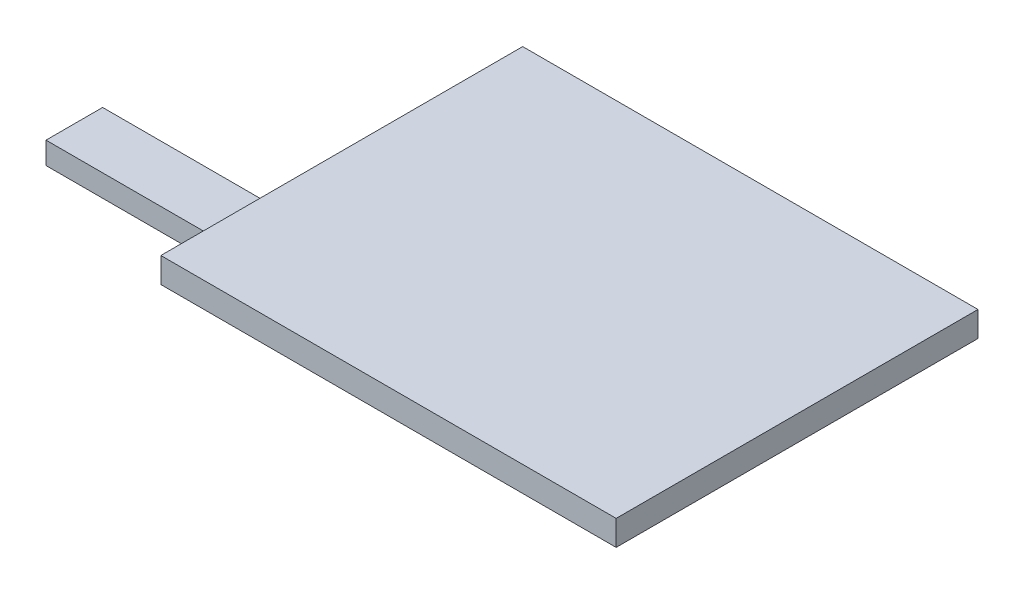
ISO-10303-21;
HEADER;
FILE_DESCRIPTION(('STEP AP214'),'2;1');
FILE_NAME('part.step','',(''),(''),'','','');
FILE_SCHEMA(('AUTOMOTIVE_DESIGN { 1 0 10303 214 1 1 1 1 }'));
ENDSEC;
DATA;
#1=APPLICATION_CONTEXT('core data for automotive mechanical design processes');
#2=APPLICATION_PROTOCOL_DEFINITION('international standard','automotive_design',2000,#1);
#3=PRODUCT_CONTEXT('',#1,'mechanical');
#4=PRODUCT('Part','Part','',(#3));
#5=PRODUCT_RELATED_PRODUCT_CATEGORY('part','',(#4));
#6=PRODUCT_DEFINITION_FORMATION('','',#4);
#7=PRODUCT_DEFINITION_CONTEXT('part definition',#1,'design');
#8=PRODUCT_DEFINITION('design','',#6,#7);
#9=PRODUCT_DEFINITION_SHAPE('','',#8);
#10=(LENGTH_UNIT() NAMED_UNIT(*) SI_UNIT(.MILLI.,.METRE.));
#11=(NAMED_UNIT(*) PLANE_ANGLE_UNIT() SI_UNIT($,.RADIAN.));
#12=(NAMED_UNIT(*) SI_UNIT($,.STERADIAN.) SOLID_ANGLE_UNIT());
#13=UNCERTAINTY_MEASURE_WITH_UNIT(LENGTH_MEASURE(1.E-05),#10,'distance_accuracy_value','');
#14=(GEOMETRIC_REPRESENTATION_CONTEXT(3) GLOBAL_UNCERTAINTY_ASSIGNED_CONTEXT((#13)) GLOBAL_UNIT_ASSIGNED_CONTEXT((#10,
#11,#12)) REPRESENTATION_CONTEXT('',''));
#15=CARTESIAN_POINT('',(0.,0.,0.));
#16=DIRECTION('',(0.,0.,1.));
#17=DIRECTION('',(1.,0.,0.));
#18=AXIS2_PLACEMENT_3D('',#15,#16,#17);
#19=CARTESIAN_POINT('',(107.24977557288,3.07276163477441,115.));
#20=DIRECTION('',(0.,1.,0.));
#21=DIRECTION('',(-1.,0.,0.));
#22=AXIS2_PLACEMENT_3D('',#19,#20,#21);
#23=PLANE('',#22);
#24=DIRECTION('',(0.,0.,1.));
#25=VECTOR('',#24,1.);
#26=CARTESIAN_POINT('',(-27.4502244271202,3.07276163477439,86.5));
#27=LINE('',#26,#25);
#28=CARTESIAN_POINT('',(-27.4502244271202,3.07276163477439,58.5));
#29=VERTEX_POINT('',#28);
#30=CARTESIAN_POINT('',(-27.4502244271202,3.07276163477439,96.5));
#31=VERTEX_POINT('',#30);
#32=EDGE_CURVE('E147',#29,#31,#27,.T.);
#33=ORIENTED_EDGE('',*,*,#32,.F.);
#34=DIRECTION('',(1.,0.,0.));
#35=VECTOR('',#34,1.);
#36=CARTESIAN_POINT('',(-37.4502244271202,3.07276163477439,58.5));
#37=LINE('',#36,#35);
#38=CARTESIAN_POINT('',(-37.4502244271202,3.07276163477439,58.5));
#39=VERTEX_POINT('',#38);
#40=EDGE_CURVE('E136',#39,#29,#37,.T.);
#41=ORIENTED_EDGE('',*,*,#40,.F.);
#42=DIRECTION('',(0.,0.,-1.));
#43=VECTOR('',#42,1.);
#44=CARTESIAN_POINT('',(-37.4502244271202,3.07276163477439,115.));
#45=LINE('',#44,#43);
#46=CARTESIAN_POINT('',(-37.4502244271202,3.07276163477439,0.));
#47=VERTEX_POINT('',#46);
#48=EDGE_CURVE('E41',#39,#47,#45,.T.);
#49=ORIENTED_EDGE('',*,*,#48,.T.);
#50=DIRECTION('',(1.,0.,0.));
#51=VECTOR('',#50,1.);
#52=CARTESIAN_POINT('',(107.24977557288,3.07276163477441,0.));
#53=LINE('',#52,#51);
#54=CARTESIAN_POINT('',(107.24977557288,3.07276163477441,0.));
#55=VERTEX_POINT('',#54);
#56=EDGE_CURVE('E167',#47,#55,#53,.T.);
#57=ORIENTED_EDGE('',*,*,#56,.T.);
#58=DIRECTION('',(0.,0.,-1.));
#59=VECTOR('',#58,1.);
#60=CARTESIAN_POINT('',(107.24977557288,3.07276163477441,115.));
#61=LINE('',#60,#59);
#62=CARTESIAN_POINT('',(107.24977557288,3.07276163477441,115.));
#63=VERTEX_POINT('',#62);
#64=EDGE_CURVE('E153',#63,#55,#61,.T.);
#65=ORIENTED_EDGE('',*,*,#64,.F.);
#66=DIRECTION('',(1.,0.,0.));
#67=VECTOR('',#66,1.);
#68=CARTESIAN_POINT('',(107.24977557288,3.07276163477441,115.));
#69=LINE('',#68,#67);
#70=CARTESIAN_POINT('',(-37.4502244271202,3.07276163477439,115.));
#71=VERTEX_POINT('',#70);
#72=EDGE_CURVE('E85',#71,#63,#69,.T.);
#73=ORIENTED_EDGE('',*,*,#72,.F.);
#74=CARTESIAN_POINT('',(-37.4502244271202,3.07276163477439,96.5));
#75=VERTEX_POINT('',#74);
#76=EDGE_CURVE('E11',#71,#75,#45,.T.);
#77=ORIENTED_EDGE('',*,*,#76,.T.);
#78=DIRECTION('',(-1.,0.,0.));
#79=VECTOR('',#78,1.);
#80=CARTESIAN_POINT('',(-37.4502244271202,3.07276163477439,96.5));
#81=LINE('',#80,#79);
#82=EDGE_CURVE('E203',#31,#75,#81,.T.);
#83=ORIENTED_EDGE('',*,*,#82,.F.);
#84=EDGE_LOOP('',(#33,#41,#49,#57,#65,#73,#77,#83));
#85=FACE_BOUND('',#84,.T.);
#86=ADVANCED_FACE('F33',(#85),#23,.F.);
#87=CARTESIAN_POINT('',(-27.4502244271202,-10.9272383652256,68.5));
#88=DIRECTION('',(0.,0.,1.));
#89=DIRECTION('',(1.,0.,0.));
#90=AXIS2_PLACEMENT_3D('',#87,#88,#89);
#91=PLANE('',#90);
#92=DIRECTION('',(0.,1.,0.));
#93=VECTOR('',#92,1.);
#94=CARTESIAN_POINT('',(-37.4502244271202,-10.9272383652256,68.5));
#95=LINE('',#94,#93);
#96=CARTESIAN_POINT('',(-37.4502244271202,-10.9272383652256,68.5));
#97=VERTEX_POINT('',#96);
#98=CARTESIAN_POINT('',(-37.4502244271202,-3.92723836522561,68.5));
#99=VERTEX_POINT('',#98);
#100=EDGE_CURVE('E143',#97,#99,#95,.T.);
#101=ORIENTED_EDGE('',*,*,#100,.F.);
#102=DIRECTION('',(1.,0.,0.));
#103=VECTOR('',#102,1.);
#104=CARTESIAN_POINT('',(-27.4502244271202,-10.9272383652256,68.5));
#105=LINE('',#104,#103);
#106=CARTESIAN_POINT('',(-102.45022442712,-10.9272383652256,68.5));
#107=VERTEX_POINT('',#106);
#108=EDGE_CURVE('E177',#107,#97,#105,.T.);
#109=ORIENTED_EDGE('',*,*,#108,.F.);
#110=DIRECTION('',(0.,-1.,0.));
#111=VECTOR('',#110,1.);
#112=CARTESIAN_POINT('',(-102.45022442712,-10.9272383652256,68.5));
#113=LINE('',#112,#111);
#114=CARTESIAN_POINT('',(-102.45022442712,-3.92723836522561,68.5));
#115=VERTEX_POINT('',#114);
#116=EDGE_CURVE('E189',#115,#107,#113,.T.);
#117=ORIENTED_EDGE('',*,*,#116,.F.);
#118=DIRECTION('',(1.,0.,0.));
#119=VECTOR('',#118,1.);
#120=CARTESIAN_POINT('',(-102.45022442712,-3.92723836522561,68.5));
#121=LINE('',#120,#119);
#122=EDGE_CURVE('E186',#115,#99,#121,.T.);
#123=ORIENTED_EDGE('',*,*,#122,.T.);
#124=EDGE_LOOP('',(#101,#109,#117,#123));
#125=FACE_BOUND('',#124,.T.);
#126=ADVANCED_FACE('F225',(#125),#91,.F.);
#127=CARTESIAN_POINT('',(-37.4502244271202,-10.9272383652256,86.5));
#128=DIRECTION('',(0.,0.,-1.));
#129=DIRECTION('',(-1.,0.,0.));
#130=AXIS2_PLACEMENT_3D('',#127,#128,#129);
#131=PLANE('',#130);
#132=DIRECTION('',(0.,-1.,0.));
#133=VECTOR('',#132,1.);
#134=CARTESIAN_POINT('',(-37.4502244271202,-10.9272383652256,86.5));
#135=LINE('',#134,#133);
#136=CARTESIAN_POINT('',(-37.4502244271202,-3.92723836522561,86.5));
#137=VERTEX_POINT('',#136);
#138=CARTESIAN_POINT('',(-37.4502244271202,-10.9272383652256,86.5));
#139=VERTEX_POINT('',#138);
#140=EDGE_CURVE('E204',#137,#139,#135,.T.);
#141=ORIENTED_EDGE('',*,*,#140,.F.);
#142=DIRECTION('',(1.,0.,0.));
#143=VECTOR('',#142,1.);
#144=CARTESIAN_POINT('',(-102.45022442712,-3.92723836522561,86.5));
#145=LINE('',#144,#143);
#146=CARTESIAN_POINT('',(-102.45022442712,-3.92723836522561,86.5));
#147=VERTEX_POINT('',#146);
#148=EDGE_CURVE('E178',#147,#137,#145,.T.);
#149=ORIENTED_EDGE('',*,*,#148,.F.);
#150=DIRECTION('',(0.,1.,0.));
#151=VECTOR('',#150,1.);
#152=CARTESIAN_POINT('',(-102.45022442712,-3.92723836522561,86.5));
#153=LINE('',#152,#151);
#154=CARTESIAN_POINT('',(-102.45022442712,-10.9272383652256,86.5));
#155=VERTEX_POINT('',#154);
#156=EDGE_CURVE('E198',#155,#147,#153,.T.);
#157=ORIENTED_EDGE('',*,*,#156,.F.);
#158=DIRECTION('',(-1.,0.,0.));
#159=VECTOR('',#158,1.);
#160=CARTESIAN_POINT('',(-37.4502244271202,-10.9272383652256,86.5));
#161=LINE('',#160,#159);
#162=EDGE_CURVE('E170',#139,#155,#161,.T.);
#163=ORIENTED_EDGE('',*,*,#162,.F.);
#164=EDGE_LOOP('',(#141,#149,#157,#163));
#165=FACE_BOUND('',#164,.T.);
#166=ADVANCED_FACE('F236',(#165),#131,.F.);
#167=CARTESIAN_POINT('',(-37.4502244271202,3.07276163477439,115.));
#168=DIRECTION('',(1.,0.,0.));
#169=DIRECTION('',(0.,0.,-1.));
#170=AXIS2_PLACEMENT_3D('',#167,#168,#169);
#171=PLANE('',#170);
#172=ORIENTED_EDGE('',*,*,#48,.F.);
#173=DIRECTION('',(0.,1.,0.));
#174=VECTOR('',#173,1.);
#175=CARTESIAN_POINT('',(-37.4502244271202,-3.92723836522561,58.5));
#176=LINE('',#175,#174);
#177=CARTESIAN_POINT('',(-37.4502244271202,-10.9272383652256,58.5));
#178=VERTEX_POINT('',#177);
#179=EDGE_CURVE('E132',#178,#39,#176,.T.);
#180=ORIENTED_EDGE('',*,*,#179,.F.);
#181=DIRECTION('',(0.,0.,1.));
#182=VECTOR('',#181,1.);
#183=CARTESIAN_POINT('',(-37.4502244271202,-10.9272383652256,58.5));
#184=LINE('',#183,#182);
#185=EDGE_CURVE('E207',#178,#97,#184,.T.);
#186=ORIENTED_EDGE('',*,*,#185,.T.);
#187=ORIENTED_EDGE('',*,*,#100,.T.);
#188=DIRECTION('',(0.,0.,-1.));
#189=VECTOR('',#188,1.);
#190=CARTESIAN_POINT('',(-37.4502244271202,-3.92723836522561,68.5));
#191=LINE('',#190,#189);
#192=EDGE_CURVE('E190',#137,#99,#191,.T.);
#193=ORIENTED_EDGE('',*,*,#192,.F.);
#194=ORIENTED_EDGE('',*,*,#140,.T.);
#195=DIRECTION('',(0.,0.,-1.));
#196=VECTOR('',#195,1.);
#197=CARTESIAN_POINT('',(-37.4502244271202,-10.9272383652256,96.5));
#198=LINE('',#197,#196);
#199=CARTESIAN_POINT('',(-37.4502244271202,-10.9272383652256,96.5));
#200=VERTEX_POINT('',#199);
#201=EDGE_CURVE('E48',#200,#139,#198,.T.);
#202=ORIENTED_EDGE('',*,*,#201,.F.);
#203=DIRECTION('',(0.,-1.,0.));
#204=VECTOR('',#203,1.);
#205=CARTESIAN_POINT('',(-37.4502244271202,-3.92723836522561,96.5));
#206=LINE('',#205,#204);
#207=EDGE_CURVE('E206',#75,#200,#206,.T.);
#208=ORIENTED_EDGE('',*,*,#207,.F.);
#209=ORIENTED_EDGE('',*,*,#76,.F.);
#210=DIRECTION('',(0.,-1.,0.));
#211=VECTOR('',#210,1.);
#212=CARTESIAN_POINT('',(-37.4502244271202,3.07276163477439,115.));
#213=LINE('',#212,#211);
#214=CARTESIAN_POINT('',(-37.4502244271202,11.0727616347744,115.));
#215=VERTEX_POINT('',#214);
#216=EDGE_CURVE('E164',#215,#71,#213,.T.);
#217=ORIENTED_EDGE('',*,*,#216,.F.);
#218=DIRECTION('',(0.,0.,-1.));
#219=VECTOR('',#218,1.);
#220=CARTESIAN_POINT('',(-37.4502244271202,11.0727616347744,115.));
#221=LINE('',#220,#219);
#222=CARTESIAN_POINT('',(-37.4502244271202,11.0727616347744,0.));
#223=VERTEX_POINT('',#222);
#224=EDGE_CURVE('E159',#215,#223,#221,.T.);
#225=ORIENTED_EDGE('',*,*,#224,.T.);
#226=DIRECTION('',(0.,-1.,0.));
#227=VECTOR('',#226,1.);
#228=CARTESIAN_POINT('',(-37.4502244271202,3.07276163477439,0.));
#229=LINE('',#228,#227);
#230=EDGE_CURVE('E152',#223,#47,#229,.T.);
#231=ORIENTED_EDGE('',*,*,#230,.T.);
#232=EDGE_LOOP('',(#172,#180,#186,#187,#193,#194,#202,#208,#209,#217,#225,#231));
#233=FACE_BOUND('',#232,.T.);
#234=ADVANCED_FACE('F35',(#233),#171,.F.);
#235=CARTESIAN_POINT('',(107.24977557288,11.0727616347744,115.));
#236=DIRECTION('',(-1.,0.,0.));
#237=DIRECTION('',(0.,0.,1.));
#238=AXIS2_PLACEMENT_3D('',#235,#236,#237);
#239=PLANE('',#238);
#240=DIRECTION('',(0.,1.,0.));
#241=VECTOR('',#240,1.);
#242=CARTESIAN_POINT('',(107.24977557288,11.0727616347744,0.));
#243=LINE('',#242,#241);
#244=CARTESIAN_POINT('',(107.24977557288,11.0727616347744,0.));
#245=VERTEX_POINT('',#244);
#246=EDGE_CURVE('E165',#55,#245,#243,.T.);
#247=ORIENTED_EDGE('',*,*,#246,.T.);
#248=DIRECTION('',(0.,0.,-1.));
#249=VECTOR('',#248,1.);
#250=CARTESIAN_POINT('',(107.24977557288,11.0727616347744,115.));
#251=LINE('',#250,#249);
#252=CARTESIAN_POINT('',(107.24977557288,11.0727616347744,115.));
#253=VERTEX_POINT('',#252);
#254=EDGE_CURVE('E155',#253,#245,#251,.T.);
#255=ORIENTED_EDGE('',*,*,#254,.F.);
#256=DIRECTION('',(0.,1.,0.));
#257=VECTOR('',#256,1.);
#258=CARTESIAN_POINT('',(107.24977557288,11.0727616347744,115.));
#259=LINE('',#258,#257);
#260=EDGE_CURVE('E172',#63,#253,#259,.T.);
#261=ORIENTED_EDGE('',*,*,#260,.F.);
#262=ORIENTED_EDGE('',*,*,#64,.T.);
#263=EDGE_LOOP('',(#247,#255,#261,#262));
#264=FACE_BOUND('',#263,.T.);
#265=ADVANCED_FACE('F257',(#264),#239,.F.);
#266=CARTESIAN_POINT('',(-37.4502244271202,11.0727616347744,115.));
#267=DIRECTION('',(0.,-1.,0.));
#268=DIRECTION('',(0.,0.,-1.));
#269=AXIS2_PLACEMENT_3D('',#266,#267,#268);
#270=PLANE('',#269);
#271=DIRECTION('',(-1.,0.,0.));
#272=VECTOR('',#271,1.);
#273=CARTESIAN_POINT('',(-37.4502244271202,11.0727616347744,0.));
#274=LINE('',#273,#272);
#275=EDGE_CURVE('E78',#245,#223,#274,.T.);
#276=ORIENTED_EDGE('',*,*,#275,.T.);
#277=ORIENTED_EDGE('',*,*,#224,.F.);
#278=DIRECTION('',(-1.,0.,0.));
#279=VECTOR('',#278,1.);
#280=CARTESIAN_POINT('',(-37.4502244271202,11.0727616347744,115.));
#281=LINE('',#280,#279);
#282=EDGE_CURVE('E57',#253,#215,#281,.T.);
#283=ORIENTED_EDGE('',*,*,#282,.F.);
#284=ORIENTED_EDGE('',*,*,#254,.T.);
#285=EDGE_LOOP('',(#276,#277,#283,#284));
#286=FACE_BOUND('',#285,.T.);
#287=ADVANCED_FACE('F260',(#286),#270,.F.);
#288=CARTESIAN_POINT('',(0.,0.,115.));
#289=DIRECTION('',(0.,0.,-1.));
#290=DIRECTION('',(-1.,0.,0.));
#291=AXIS2_PLACEMENT_3D('',#288,#289,#290);
#292=PLANE('',#291);
#293=ORIENTED_EDGE('',*,*,#216,.T.);
#294=ORIENTED_EDGE('',*,*,#72,.T.);
#295=ORIENTED_EDGE('',*,*,#260,.T.);
#296=ORIENTED_EDGE('',*,*,#282,.T.);
#297=EDGE_LOOP('',(#293,#294,#295,#296));
#298=FACE_BOUND('',#297,.T.);
#299=ADVANCED_FACE('F263',(#298),#292,.F.);
#300=CARTESIAN_POINT('',(0.,0.,0.));
#301=DIRECTION('',(0.,0.,-1.));
#302=DIRECTION('',(-1.,0.,0.));
#303=AXIS2_PLACEMENT_3D('',#300,#301,#302);
#304=PLANE('',#303);
#305=ORIENTED_EDGE('',*,*,#230,.F.);
#306=ORIENTED_EDGE('',*,*,#275,.F.);
#307=ORIENTED_EDGE('',*,*,#246,.F.);
#308=ORIENTED_EDGE('',*,*,#56,.F.);
#309=EDGE_LOOP('',(#305,#306,#307,#308));
#310=FACE_BOUND('',#309,.T.);
#311=ADVANCED_FACE('F264',(#310),#304,.T.);
#312=CARTESIAN_POINT('',(-27.4502244271202,-10.9272383652256,86.5));
#313=DIRECTION('',(-1.,0.,0.));
#314=DIRECTION('',(0.,0.,1.));
#315=AXIS2_PLACEMENT_3D('',#312,#313,#314);
#316=PLANE('',#315);
#317=ORIENTED_EDGE('',*,*,#32,.T.);
#318=DIRECTION('',(0.,1.,0.));
#319=VECTOR('',#318,1.);
#320=CARTESIAN_POINT('',(-27.4502244271202,-3.92723836522561,96.5));
#321=LINE('',#320,#319);
#322=CARTESIAN_POINT('',(-27.4502244271202,-10.9272383652256,96.5));
#323=VERTEX_POINT('',#322);
#324=EDGE_CURVE('E209',#323,#31,#321,.T.);
#325=ORIENTED_EDGE('',*,*,#324,.F.);
#326=DIRECTION('',(0.,0.,1.));
#327=VECTOR('',#326,1.);
#328=CARTESIAN_POINT('',(-27.4502244271202,-10.9272383652256,86.5));
#329=LINE('',#328,#327);
#330=CARTESIAN_POINT('',(-27.4502244271202,-10.9272383652256,58.5));
#331=VERTEX_POINT('',#330);
#332=EDGE_CURVE('E180',#331,#323,#329,.T.);
#333=ORIENTED_EDGE('',*,*,#332,.F.);
#334=DIRECTION('',(0.,-1.,0.));
#335=VECTOR('',#334,1.);
#336=CARTESIAN_POINT('',(-27.4502244271202,3.07276163477439,58.5));
#337=LINE('',#336,#335);
#338=EDGE_CURVE('E148',#29,#331,#337,.T.);
#339=ORIENTED_EDGE('',*,*,#338,.F.);
#340=EDGE_LOOP('',(#317,#325,#333,#339));
#341=FACE_BOUND('',#340,.T.);
#342=ADVANCED_FACE('F267',(#341),#316,.F.);
#343=CARTESIAN_POINT('',(0.,-10.9272383652256,0.));
#344=DIRECTION('',(0.,1.,0.));
#345=DIRECTION('',(-1.,0.,0.));
#346=AXIS2_PLACEMENT_3D('',#343,#344,#345);
#347=PLANE('',#346);
#348=ORIENTED_EDGE('',*,*,#332,.T.);
#349=DIRECTION('',(1.,0.,0.));
#350=VECTOR('',#349,1.);
#351=CARTESIAN_POINT('',(-27.4502244271202,-10.9272383652256,96.5));
#352=LINE('',#351,#350);
#353=EDGE_CURVE('E212',#200,#323,#352,.T.);
#354=ORIENTED_EDGE('',*,*,#353,.F.);
#355=ORIENTED_EDGE('',*,*,#201,.T.);
#356=ORIENTED_EDGE('',*,*,#162,.T.);
#357=DIRECTION('',(0.,0.,1.));
#358=VECTOR('',#357,1.);
#359=CARTESIAN_POINT('',(-102.45022442712,-10.9272383652256,86.5));
#360=LINE('',#359,#358);
#361=EDGE_CURVE('E193',#107,#155,#360,.T.);
#362=ORIENTED_EDGE('',*,*,#361,.F.);
#363=ORIENTED_EDGE('',*,*,#108,.T.);
#364=ORIENTED_EDGE('',*,*,#185,.F.);
#365=DIRECTION('',(-1.,0.,0.));
#366=VECTOR('',#365,1.);
#367=CARTESIAN_POINT('',(-27.4502244271202,-10.9272383652256,58.5));
#368=LINE('',#367,#366);
#369=EDGE_CURVE('E139',#331,#178,#368,.T.);
#370=ORIENTED_EDGE('',*,*,#369,.F.);
#371=EDGE_LOOP('',(#348,#354,#355,#356,#362,#363,#364,#370));
#372=FACE_BOUND('',#371,.T.);
#373=ADVANCED_FACE('F220',(#372),#347,.F.);
#374=CARTESIAN_POINT('',(-102.45022442712,-3.92723836522561,68.5));
#375=DIRECTION('',(0.,-1.,0.));
#376=DIRECTION('',(0.,0.,-1.));
#377=AXIS2_PLACEMENT_3D('',#374,#375,#376);
#378=PLANE('',#377);
#379=ORIENTED_EDGE('',*,*,#192,.T.);
#380=ORIENTED_EDGE('',*,*,#122,.F.);
#381=DIRECTION('',(0.,0.,-1.));
#382=VECTOR('',#381,1.);
#383=CARTESIAN_POINT('',(-102.45022442712,-3.92723836522561,68.5));
#384=LINE('',#383,#382);
#385=EDGE_CURVE('E196',#147,#115,#384,.T.);
#386=ORIENTED_EDGE('',*,*,#385,.F.);
#387=ORIENTED_EDGE('',*,*,#148,.T.);
#388=EDGE_LOOP('',(#379,#380,#386,#387));
#389=FACE_BOUND('',#388,.T.);
#390=ADVANCED_FACE('F230',(#389),#378,.F.);
#391=CARTESIAN_POINT('',(-102.45022442712,0.,0.));
#392=DIRECTION('',(1.,0.,0.));
#393=DIRECTION('',(0.,0.,-1.));
#394=AXIS2_PLACEMENT_3D('',#391,#392,#393);
#395=PLANE('',#394);
#396=ORIENTED_EDGE('',*,*,#361,.T.);
#397=ORIENTED_EDGE('',*,*,#156,.T.);
#398=ORIENTED_EDGE('',*,*,#385,.T.);
#399=ORIENTED_EDGE('',*,*,#116,.T.);
#400=EDGE_LOOP('',(#396,#397,#398,#399));
#401=FACE_BOUND('',#400,.T.);
#402=ADVANCED_FACE('F238',(#401),#395,.F.);
#403=CARTESIAN_POINT('',(0.,0.,96.5));
#404=DIRECTION('',(0.,0.,-1.));
#405=DIRECTION('',(-1.,0.,0.));
#406=AXIS2_PLACEMENT_3D('',#403,#404,#405);
#407=PLANE('',#406);
#408=ORIENTED_EDGE('',*,*,#207,.T.);
#409=ORIENTED_EDGE('',*,*,#353,.T.);
#410=ORIENTED_EDGE('',*,*,#324,.T.);
#411=ORIENTED_EDGE('',*,*,#82,.T.);
#412=EDGE_LOOP('',(#408,#409,#410,#411));
#413=FACE_BOUND('',#412,.T.);
#414=ADVANCED_FACE('F240',(#413),#407,.F.);
#415=CARTESIAN_POINT('',(0.,0.,58.5));
#416=DIRECTION('',(0.,0.,-1.));
#417=DIRECTION('',(-1.,0.,0.));
#418=AXIS2_PLACEMENT_3D('',#415,#416,#417);
#419=PLANE('',#418);
#420=ORIENTED_EDGE('',*,*,#179,.T.);
#421=ORIENTED_EDGE('',*,*,#40,.T.);
#422=ORIENTED_EDGE('',*,*,#338,.T.);
#423=ORIENTED_EDGE('',*,*,#369,.T.);
#424=EDGE_LOOP('',(#420,#421,#422,#423));
#425=FACE_BOUND('',#424,.T.);
#426=ADVANCED_FACE('F134',(#425),#419,.T.);
#427=CLOSED_SHELL('',(#86,#126,#166,#234,#265,#287,#299,#311,#342,#373,#390,#402,#414,#426));
#428=MANIFOLD_SOLID_BREP('B2',#427);
#429=ADVANCED_BREP_SHAPE_REPRESENTATION('',(#18,#428),#14);
#430=SHAPE_DEFINITION_REPRESENTATION(#9,#429);
ENDSEC;
END-ISO-10303-21;
